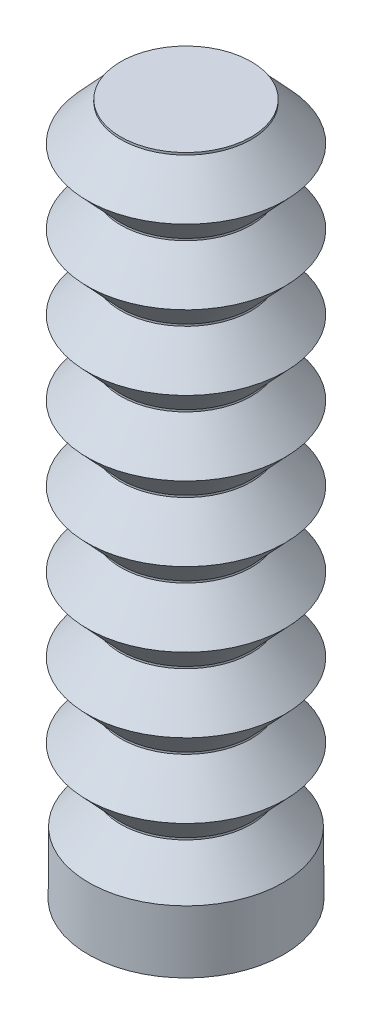
ISO-10303-21;
HEADER;
FILE_DESCRIPTION(('STEP AP214'),'2;1');
FILE_NAME('part.step','',(''),(''),'','','');
FILE_SCHEMA(('AUTOMOTIVE_DESIGN { 1 0 10303 214 1 1 1 1 }'));
ENDSEC;
DATA;
#1=APPLICATION_CONTEXT('core data for automotive mechanical design processes');
#2=APPLICATION_PROTOCOL_DEFINITION('international standard','automotive_design',2000,#1);
#3=PRODUCT_CONTEXT('',#1,'mechanical');
#4=PRODUCT('Part','Part','',(#3));
#5=PRODUCT_RELATED_PRODUCT_CATEGORY('part','',(#4));
#6=PRODUCT_DEFINITION_FORMATION('','',#4);
#7=PRODUCT_DEFINITION_CONTEXT('part definition',#1,'design');
#8=PRODUCT_DEFINITION('design','',#6,#7);
#9=PRODUCT_DEFINITION_SHAPE('','',#8);
#10=(LENGTH_UNIT() NAMED_UNIT(*) SI_UNIT(.MILLI.,.METRE.));
#11=(NAMED_UNIT(*) PLANE_ANGLE_UNIT() SI_UNIT($,.RADIAN.));
#12=(NAMED_UNIT(*) SI_UNIT($,.STERADIAN.) SOLID_ANGLE_UNIT());
#13=UNCERTAINTY_MEASURE_WITH_UNIT(LENGTH_MEASURE(1.E-05),#10,'distance_accuracy_value','');
#14=(GEOMETRIC_REPRESENTATION_CONTEXT(3) GLOBAL_UNCERTAINTY_ASSIGNED_CONTEXT((#13)) GLOBAL_UNIT_ASSIGNED_CONTEXT((#10,
#11,#12)) REPRESENTATION_CONTEXT('',''));
#15=CARTESIAN_POINT('',(0.,0.,0.));
#16=DIRECTION('',(0.,0.,1.));
#17=DIRECTION('',(1.,0.,0.));
#18=AXIS2_PLACEMENT_3D('',#15,#16,#17);
#19=CARTESIAN_POINT('',(-5.43163068128709,-0.900000000000158,0.));
#20=DIRECTION('',(0.,1.,0.));
#21=DIRECTION('',(-1.,0.,0.));
#22=AXIS2_PLACEMENT_3D('',#19,#20,#21);
#23=CONICAL_SURFACE('',#22,4.9365081526756,1.56509007290564);
#24=CARTESIAN_POINT('',(-5.43163068128709,-0.904564978337837,0.));
#25=DIRECTION('',(0.,-1.,0.));
#26=DIRECTION('',(1.,0.,0.));
#27=AXIS2_PLACEMENT_3D('',#24,#25,#26);
#28=CIRCLE('',#27,4.13652117717364);
#29=CARTESIAN_POINT('',(-1.29510950411345,-0.904564978337837,0.));
#30=VERTEX_POINT('',#29);
#31=EDGE_CURVE('E57',#30,#30,#28,.T.);
#32=ORIENTED_EDGE('',*,*,#31,.F.);
#33=EDGE_LOOP('',(#32));
#34=FACE_BOUND('',#33,.T.);
#35=CARTESIAN_POINT('',(-5.43163068128709,-0.900000000000158,0.));
#36=DIRECTION('',(0.,-1.,0.));
#37=DIRECTION('',(1.,0.,0.));
#38=AXIS2_PLACEMENT_3D('',#35,#36,#37);
#39=CIRCLE('',#38,4.9365081526756);
#40=CARTESIAN_POINT('',(-0.495122528611489,-0.900000000000157,0.));
#41=VERTEX_POINT('',#40);
#42=EDGE_CURVE('E59',#41,#41,#39,.T.);
#43=ORIENTED_EDGE('',*,*,#42,.T.);
#44=EDGE_LOOP('',(#43));
#45=FACE_BOUND('',#44,.T.);
#46=ADVANCED_FACE('F37',(#34,#45),#23,.T.);
#47=CARTESIAN_POINT('',(-2.13163068128709,33.3029540037317,0.));
#48=DIRECTION('',(0.,-1.,0.));
#49=DIRECTION('',(1.,0.,0.));
#50=AXIS2_PLACEMENT_3D('',#47,#48,#49);
#51=PLANE('',#50);
#52=CARTESIAN_POINT('',(-5.43163068128709,33.3029540037317,0.));
#53=DIRECTION('',(0.,-1.,0.));
#54=DIRECTION('',(1.,0.,0.));
#55=AXIS2_PLACEMENT_3D('',#52,#53,#54);
#56=CIRCLE('',#55,2.84519448310834);
#57=CARTESIAN_POINT('',(-2.58643619817875,33.3029540037317,0.));
#58=VERTEX_POINT('',#57);
#59=EDGE_CURVE('E10',#58,#58,#56,.T.);
#60=ORIENTED_EDGE('',*,*,#59,.T.);
#61=EDGE_LOOP('',(#60));
#62=FACE_BOUND('',#61,.T.);
#63=ADVANCED_FACE('F287',(#62),#51,.T.);
#64=CARTESIAN_POINT('',(-5.43163068128709,33.4431266067998,0.));
#65=DIRECTION('',(0.,-1.,0.));
#66=DIRECTION('',(1.,0.,0.));
#67=AXIS2_PLACEMENT_3D('',#64,#65,#66);
#68=CONICAL_SURFACE('',#67,2.71462274326405,0.749952023138734);
#69=CARTESIAN_POINT('',(-5.43163068128709,32.1634095308826,0.));
#70=DIRECTION('',(0.,-1.,0.));
#71=DIRECTION('',(1.,0.,0.));
#72=AXIS2_PLACEMENT_3D('',#69,#70,#71);
#73=CIRCLE('',#72,3.90668796466637);
#74=CARTESIAN_POINT('',(-1.52494271662073,32.1634095308826,0.));
#75=VERTEX_POINT('',#74);
#76=EDGE_CURVE('E45',#75,#75,#73,.T.);
#77=ORIENTED_EDGE('',*,*,#76,.T.);
#78=EDGE_LOOP('',(#77));
#79=FACE_BOUND('',#78,.T.);
#80=ORIENTED_EDGE('',*,*,#59,.F.);
#81=EDGE_LOOP('',(#80));
#82=FACE_BOUND('',#81,.T.);
#83=ADVANCED_FACE('F284',(#79,#82),#68,.F.);
#84=CARTESIAN_POINT('',(-5.43163068128709,32.7086924549654,0.));
#85=DIRECTION('',(0.,1.,0.));
#86=DIRECTION('',(-1.,0.,0.));
#87=AXIS2_PLACEMENT_3D('',#84,#85,#86);
#88=CONICAL_SURFACE('',#87,4.41462274326405,0.749952023138734);
#89=CARTESIAN_POINT('',(-5.43163068128709,30.6532886276378,0.));
#90=DIRECTION('',(0.,1.,0.));
#91=DIRECTION('',(-1.,0.,0.));
#92=AXIS2_PLACEMENT_3D('',#89,#90,#91);
#93=CIRCLE('',#92,2.5);
#94=CARTESIAN_POINT('',(-7.93163068128709,30.6532886276378,0.));
#95=VERTEX_POINT('',#94);
#96=EDGE_CURVE('E53',#95,#95,#93,.F.);
#97=ORIENTED_EDGE('',*,*,#96,.T.);
#98=EDGE_LOOP('',(#97));
#99=FACE_BOUND('',#98,.T.);
#100=ORIENTED_EDGE('',*,*,#76,.F.);
#101=EDGE_LOOP('',(#100));
#102=FACE_BOUND('',#101,.T.);
#103=ADVANCED_FACE('F269',(#99,#102),#88,.F.);
#104=CARTESIAN_POINT('',(-5.43163068128709,34.1029540037317,0.));
#105=DIRECTION('',(0.,-1.,0.));
#106=DIRECTION('',(1.,0.,0.));
#107=AXIS2_PLACEMENT_3D('',#104,#105,#106);
#108=CYLINDRICAL_SURFACE('',#107,2.5);
#109=CARTESIAN_POINT('',(-5.43163068128709,29.9235304341274,0.));
#110=DIRECTION('',(0.,-1.,0.));
#111=DIRECTION('',(1.,0.,0.));
#112=AXIS2_PLACEMENT_3D('',#109,#110,#111);
#113=CIRCLE('',#112,2.5);
#114=CARTESIAN_POINT('',(-2.93163068128709,29.9235304341274,0.));
#115=VERTEX_POINT('',#114);
#116=EDGE_CURVE('E261',#115,#115,#113,.T.);
#117=ORIENTED_EDGE('',*,*,#116,.T.);
#118=EDGE_LOOP('',(#117));
#119=FACE_BOUND('',#118,.T.);
#120=ORIENTED_EDGE('',*,*,#96,.F.);
#121=EDGE_LOOP('',(#120));
#122=FACE_BOUND('',#121,.T.);
#123=ADVANCED_FACE('F272',(#119,#122),#108,.F.);
#124=CARTESIAN_POINT('',(-5.43163068128709,29.6931266067998,0.));
#125=DIRECTION('',(0.,-1.,0.));
#126=DIRECTION('',(1.,0.,0.));
#127=AXIS2_PLACEMENT_3D('',#124,#125,#126);
#128=CONICAL_SURFACE('',#127,2.71462274326405,0.749952023138734);
#129=CARTESIAN_POINT('',(-5.43163068128709,28.4134095308826,0.));
#130=DIRECTION('',(0.,-1.,0.));
#131=DIRECTION('',(1.,0.,0.));
#132=AXIS2_PLACEMENT_3D('',#129,#130,#131);
#133=CIRCLE('',#132,3.90668796466641);
#134=CARTESIAN_POINT('',(-1.52494271662068,28.4134095308826,0.));
#135=VERTEX_POINT('',#134);
#136=EDGE_CURVE('E257',#135,#135,#133,.T.);
#137=ORIENTED_EDGE('',*,*,#136,.T.);
#138=EDGE_LOOP('',(#137));
#139=FACE_BOUND('',#138,.T.);
#140=ORIENTED_EDGE('',*,*,#116,.F.);
#141=EDGE_LOOP('',(#140));
#142=FACE_BOUND('',#141,.T.);
#143=ADVANCED_FACE('F274',(#139,#142),#128,.F.);
#144=CARTESIAN_POINT('',(-5.43163068128709,28.9586924549654,0.));
#145=DIRECTION('',(0.,1.,0.));
#146=DIRECTION('',(-1.,0.,0.));
#147=AXIS2_PLACEMENT_3D('',#144,#145,#146);
#148=CONICAL_SURFACE('',#147,4.41462274326409,0.749952023138734);
#149=CARTESIAN_POINT('',(-5.43163068128709,26.9032886276378,0.));
#150=DIRECTION('',(0.,1.,0.));
#151=DIRECTION('',(-1.,0.,0.));
#152=AXIS2_PLACEMENT_3D('',#149,#150,#151);
#153=CIRCLE('',#152,2.50000000000006);
#154=CARTESIAN_POINT('',(-7.93163068128715,26.9032886276378,0.));
#155=VERTEX_POINT('',#154);
#156=EDGE_CURVE('E253',#155,#155,#153,.F.);
#157=ORIENTED_EDGE('',*,*,#156,.T.);
#158=EDGE_LOOP('',(#157));
#159=FACE_BOUND('',#158,.T.);
#160=ORIENTED_EDGE('',*,*,#136,.F.);
#161=EDGE_LOOP('',(#160));
#162=FACE_BOUND('',#161,.T.);
#163=ADVANCED_FACE('F281',(#159,#162),#148,.F.);
#164=CARTESIAN_POINT('',(-5.43163068128709,34.1029540037317,0.));
#165=DIRECTION('',(0.,-1.,0.));
#166=DIRECTION('',(1.,0.,0.));
#167=AXIS2_PLACEMENT_3D('',#164,#165,#166);
#168=CYLINDRICAL_SURFACE('',#167,2.50000000000006);
#169=CARTESIAN_POINT('',(-5.43163068128709,26.1735304341273,0.));
#170=DIRECTION('',(0.,-1.,0.));
#171=DIRECTION('',(1.,0.,0.));
#172=AXIS2_PLACEMENT_3D('',#169,#170,#171);
#173=CIRCLE('',#172,2.50000000000006);
#174=CARTESIAN_POINT('',(-2.93163068128704,26.1735304341273,0.));
#175=VERTEX_POINT('',#174);
#176=EDGE_CURVE('E250',#175,#175,#173,.T.);
#177=ORIENTED_EDGE('',*,*,#176,.T.);
#178=EDGE_LOOP('',(#177));
#179=FACE_BOUND('',#178,.T.);
#180=ORIENTED_EDGE('',*,*,#156,.F.);
#181=EDGE_LOOP('',(#180));
#182=FACE_BOUND('',#181,.T.);
#183=ADVANCED_FACE('F543',(#179,#182),#168,.F.);
#184=CARTESIAN_POINT('',(-5.43163068128709,25.9431266067997,0.));
#185=DIRECTION('',(0.,-1.,0.));
#186=DIRECTION('',(1.,0.,0.));
#187=AXIS2_PLACEMENT_3D('',#184,#185,#186);
#188=CONICAL_SURFACE('',#187,2.71462274326413,0.749952023138734);
#189=CARTESIAN_POINT('',(-5.43163068128709,24.6634095308825,0.));
#190=DIRECTION('',(0.,-1.,0.));
#191=DIRECTION('',(1.,0.,0.));
#192=AXIS2_PLACEMENT_3D('',#189,#190,#191);
#193=CIRCLE('',#192,3.90668796466645);
#194=CARTESIAN_POINT('',(-1.52494271662064,24.6634095308825,0.));
#195=VERTEX_POINT('',#194);
#196=EDGE_CURVE('E246',#195,#195,#193,.T.);
#197=ORIENTED_EDGE('',*,*,#196,.T.);
#198=EDGE_LOOP('',(#197));
#199=FACE_BOUND('',#198,.T.);
#200=ORIENTED_EDGE('',*,*,#176,.F.);
#201=EDGE_LOOP('',(#200));
#202=FACE_BOUND('',#201,.T.);
#203=ADVANCED_FACE('F539',(#199,#202),#188,.F.);
#204=CARTESIAN_POINT('',(-5.43163068128709,25.2086924549653,0.));
#205=DIRECTION('',(0.,1.,0.));
#206=DIRECTION('',(-1.,0.,0.));
#207=AXIS2_PLACEMENT_3D('',#204,#205,#206);
#208=CONICAL_SURFACE('',#207,4.41462274326413,0.749952023138734);
#209=CARTESIAN_POINT('',(-5.43163068128709,23.1532886276378,0.));
#210=DIRECTION('',(0.,1.,0.));
#211=DIRECTION('',(-1.,0.,0.));
#212=AXIS2_PLACEMENT_3D('',#209,#210,#211);
#213=CIRCLE('',#212,2.5000000000001);
#214=CARTESIAN_POINT('',(-7.93163068128719,23.1532886276378,0.));
#215=VERTEX_POINT('',#214);
#216=EDGE_CURVE('E242',#215,#215,#213,.F.);
#217=ORIENTED_EDGE('',*,*,#216,.T.);
#218=EDGE_LOOP('',(#217));
#219=FACE_BOUND('',#218,.T.);
#220=ORIENTED_EDGE('',*,*,#196,.F.);
#221=EDGE_LOOP('',(#220));
#222=FACE_BOUND('',#221,.T.);
#223=ADVANCED_FACE('F535',(#219,#222),#208,.F.);
#224=CARTESIAN_POINT('',(-5.43163068128709,34.1029540037317,0.));
#225=DIRECTION('',(0.,-1.,0.));
#226=DIRECTION('',(1.,0.,0.));
#227=AXIS2_PLACEMENT_3D('',#224,#225,#226);
#228=CYLINDRICAL_SURFACE('',#227,2.5000000000001);
#229=CARTESIAN_POINT('',(-5.43163068128709,22.4235304341273,0.));
#230=DIRECTION('',(0.,-1.,0.));
#231=DIRECTION('',(1.,0.,0.));
#232=AXIS2_PLACEMENT_3D('',#229,#230,#231);
#233=CIRCLE('',#232,2.5000000000001);
#234=CARTESIAN_POINT('',(-2.931630681287,22.4235304341273,0.));
#235=VERTEX_POINT('',#234);
#236=EDGE_CURVE('E238',#235,#235,#233,.T.);
#237=ORIENTED_EDGE('',*,*,#236,.T.);
#238=EDGE_LOOP('',(#237));
#239=FACE_BOUND('',#238,.T.);
#240=ORIENTED_EDGE('',*,*,#216,.F.);
#241=EDGE_LOOP('',(#240));
#242=FACE_BOUND('',#241,.T.);
#243=ADVANCED_FACE('F531',(#239,#242),#228,.F.);
#244=CARTESIAN_POINT('',(-5.43163068128709,22.1931266067997,0.));
#245=DIRECTION('',(0.,-1.,0.));
#246=DIRECTION('',(1.,0.,0.));
#247=AXIS2_PLACEMENT_3D('',#244,#245,#246);
#248=CONICAL_SURFACE('',#247,2.71462274326417,0.749952023138733);
#249=CARTESIAN_POINT('',(-5.43163068128709,20.9134095308825,0.));
#250=DIRECTION('',(0.,-1.,0.));
#251=DIRECTION('',(1.,0.,0.));
#252=AXIS2_PLACEMENT_3D('',#249,#250,#251);
#253=CIRCLE('',#252,3.90668796466648);
#254=CARTESIAN_POINT('',(-1.52494271662061,20.9134095308825,0.));
#255=VERTEX_POINT('',#254);
#256=EDGE_CURVE('E234',#255,#255,#253,.T.);
#257=ORIENTED_EDGE('',*,*,#256,.T.);
#258=EDGE_LOOP('',(#257));
#259=FACE_BOUND('',#258,.T.);
#260=ORIENTED_EDGE('',*,*,#236,.F.);
#261=EDGE_LOOP('',(#260));
#262=FACE_BOUND('',#261,.T.);
#263=ADVANCED_FACE('F527',(#259,#262),#248,.F.);
#264=CARTESIAN_POINT('',(-5.43163068128709,21.4586924549653,0.));
#265=DIRECTION('',(0.,1.,0.));
#266=DIRECTION('',(-1.,0.,0.));
#267=AXIS2_PLACEMENT_3D('',#264,#265,#266);
#268=CONICAL_SURFACE('',#267,4.41462274326417,0.749952023138733);
#269=CARTESIAN_POINT('',(-5.43163068128709,19.4032886276377,0.));
#270=DIRECTION('',(0.,1.,0.));
#271=DIRECTION('',(-1.,0.,0.));
#272=AXIS2_PLACEMENT_3D('',#269,#270,#271);
#273=CIRCLE('',#272,2.50000000000014);
#274=CARTESIAN_POINT('',(-7.93163068128723,19.4032886276377,0.));
#275=VERTEX_POINT('',#274);
#276=EDGE_CURVE('E230',#275,#275,#273,.F.);
#277=ORIENTED_EDGE('',*,*,#276,.T.);
#278=EDGE_LOOP('',(#277));
#279=FACE_BOUND('',#278,.T.);
#280=ORIENTED_EDGE('',*,*,#256,.F.);
#281=EDGE_LOOP('',(#280));
#282=FACE_BOUND('',#281,.T.);
#283=ADVANCED_FACE('F523',(#279,#282),#268,.F.);
#284=CARTESIAN_POINT('',(-5.43163068128709,34.1029540037317,0.));
#285=DIRECTION('',(0.,-1.,0.));
#286=DIRECTION('',(1.,0.,0.));
#287=AXIS2_PLACEMENT_3D('',#284,#285,#286);
#288=CYLINDRICAL_SURFACE('',#287,2.50000000000014);
#289=CARTESIAN_POINT('',(-5.43163068128709,18.6735304341273,0.));
#290=DIRECTION('',(0.,-1.,0.));
#291=DIRECTION('',(1.,0.,0.));
#292=AXIS2_PLACEMENT_3D('',#289,#290,#291);
#293=CIRCLE('',#292,2.50000000000014);
#294=CARTESIAN_POINT('',(-2.93163068128696,18.6735304341273,0.));
#295=VERTEX_POINT('',#294);
#296=EDGE_CURVE('E226',#295,#295,#293,.T.);
#297=ORIENTED_EDGE('',*,*,#296,.T.);
#298=EDGE_LOOP('',(#297));
#299=FACE_BOUND('',#298,.T.);
#300=ORIENTED_EDGE('',*,*,#276,.F.);
#301=EDGE_LOOP('',(#300));
#302=FACE_BOUND('',#301,.T.);
#303=ADVANCED_FACE('F519',(#299,#302),#288,.F.);
#304=CARTESIAN_POINT('',(-5.43163068128709,18.4431266067997,0.));
#305=DIRECTION('',(0.,-1.,0.));
#306=DIRECTION('',(1.,0.,0.));
#307=AXIS2_PLACEMENT_3D('',#304,#305,#306);
#308=CONICAL_SURFACE('',#307,2.7146227432642,0.749952023138734);
#309=CARTESIAN_POINT('',(-5.43163068128709,17.1634095308825,0.));
#310=DIRECTION('',(0.,-1.,0.));
#311=DIRECTION('',(1.,0.,0.));
#312=AXIS2_PLACEMENT_3D('',#309,#310,#311);
#313=CIRCLE('',#312,3.90668796466652);
#314=CARTESIAN_POINT('',(-1.52494271662057,17.1634095308825,0.));
#315=VERTEX_POINT('',#314);
#316=EDGE_CURVE('E222',#315,#315,#313,.T.);
#317=ORIENTED_EDGE('',*,*,#316,.T.);
#318=EDGE_LOOP('',(#317));
#319=FACE_BOUND('',#318,.T.);
#320=ORIENTED_EDGE('',*,*,#296,.F.);
#321=EDGE_LOOP('',(#320));
#322=FACE_BOUND('',#321,.T.);
#323=ADVANCED_FACE('F515',(#319,#322),#308,.F.);
#324=CARTESIAN_POINT('',(-5.43163068128709,17.7086924549653,0.));
#325=DIRECTION('',(0.,1.,0.));
#326=DIRECTION('',(-1.,0.,0.));
#327=AXIS2_PLACEMENT_3D('',#324,#325,#326);
#328=CONICAL_SURFACE('',#327,4.4146227432642,0.749952023138733);
#329=CARTESIAN_POINT('',(-5.43163068128709,15.6532886276377,0.));
#330=DIRECTION('',(0.,1.,0.));
#331=DIRECTION('',(-1.,0.,0.));
#332=AXIS2_PLACEMENT_3D('',#329,#330,#331);
#333=CIRCLE('',#332,2.50000000000018);
#334=CARTESIAN_POINT('',(-7.93163068128727,15.6532886276377,0.));
#335=VERTEX_POINT('',#334);
#336=EDGE_CURVE('E218',#335,#335,#333,.F.);
#337=ORIENTED_EDGE('',*,*,#336,.T.);
#338=EDGE_LOOP('',(#337));
#339=FACE_BOUND('',#338,.T.);
#340=ORIENTED_EDGE('',*,*,#316,.F.);
#341=EDGE_LOOP('',(#340));
#342=FACE_BOUND('',#341,.T.);
#343=ADVANCED_FACE('F511',(#339,#342),#328,.F.);
#344=CARTESIAN_POINT('',(-5.43163068128709,34.1029540037317,0.));
#345=DIRECTION('',(0.,-1.,0.));
#346=DIRECTION('',(1.,0.,0.));
#347=AXIS2_PLACEMENT_3D('',#344,#345,#346);
#348=CYLINDRICAL_SURFACE('',#347,2.50000000000018);
#349=CARTESIAN_POINT('',(-5.43163068128709,14.9235304341272,0.));
#350=DIRECTION('',(0.,-1.,0.));
#351=DIRECTION('',(1.,0.,0.));
#352=AXIS2_PLACEMENT_3D('',#349,#350,#351);
#353=CIRCLE('',#352,2.50000000000018);
#354=CARTESIAN_POINT('',(-2.93163068128692,14.9235304341272,0.));
#355=VERTEX_POINT('',#354);
#356=EDGE_CURVE('E215',#355,#355,#353,.T.);
#357=ORIENTED_EDGE('',*,*,#356,.T.);
#358=EDGE_LOOP('',(#357));
#359=FACE_BOUND('',#358,.T.);
#360=ORIENTED_EDGE('',*,*,#336,.F.);
#361=EDGE_LOOP('',(#360));
#362=FACE_BOUND('',#361,.T.);
#363=ADVANCED_FACE('F507',(#359,#362),#348,.F.);
#364=CARTESIAN_POINT('',(-5.43163068128709,14.6931266067996,0.));
#365=DIRECTION('',(0.,-1.,0.));
#366=DIRECTION('',(1.,0.,0.));
#367=AXIS2_PLACEMENT_3D('',#364,#365,#366);
#368=CONICAL_SURFACE('',#367,2.71462274326424,0.749952023138734);
#369=CARTESIAN_POINT('',(-5.43163068128709,13.4134095308824,0.));
#370=DIRECTION('',(0.,-1.,0.));
#371=DIRECTION('',(1.,0.,0.));
#372=AXIS2_PLACEMENT_3D('',#369,#370,#371);
#373=CIRCLE('',#372,3.90668796466656);
#374=CARTESIAN_POINT('',(-1.52494271662053,13.4134095308824,0.));
#375=VERTEX_POINT('',#374);
#376=EDGE_CURVE('E211',#375,#375,#373,.T.);
#377=ORIENTED_EDGE('',*,*,#376,.T.);
#378=EDGE_LOOP('',(#377));
#379=FACE_BOUND('',#378,.T.);
#380=ORIENTED_EDGE('',*,*,#356,.F.);
#381=EDGE_LOOP('',(#380));
#382=FACE_BOUND('',#381,.T.);
#383=ADVANCED_FACE('F503',(#379,#382),#368,.F.);
#384=CARTESIAN_POINT('',(-5.43163068128709,13.9586924549652,0.));
#385=DIRECTION('',(0.,1.,0.));
#386=DIRECTION('',(-1.,0.,0.));
#387=AXIS2_PLACEMENT_3D('',#384,#385,#386);
#388=CONICAL_SURFACE('',#387,4.41462274326424,0.749952023138734);
#389=CARTESIAN_POINT('',(-5.43163068128709,11.9032886276377,0.));
#390=DIRECTION('',(0.,1.,0.));
#391=DIRECTION('',(-1.,0.,0.));
#392=AXIS2_PLACEMENT_3D('',#389,#390,#391);
#393=CIRCLE('',#392,2.50000000000021);
#394=CARTESIAN_POINT('',(-7.93163068128731,11.9032886276377,0.));
#395=VERTEX_POINT('',#394);
#396=EDGE_CURVE('E207',#395,#395,#393,.F.);
#397=ORIENTED_EDGE('',*,*,#396,.T.);
#398=EDGE_LOOP('',(#397));
#399=FACE_BOUND('',#398,.T.);
#400=ORIENTED_EDGE('',*,*,#376,.F.);
#401=EDGE_LOOP('',(#400));
#402=FACE_BOUND('',#401,.T.);
#403=ADVANCED_FACE('F499',(#399,#402),#388,.F.);
#404=CARTESIAN_POINT('',(-5.43163068128709,34.1029540037317,0.));
#405=DIRECTION('',(0.,-1.,0.));
#406=DIRECTION('',(1.,0.,0.));
#407=AXIS2_PLACEMENT_3D('',#404,#405,#406);
#408=CYLINDRICAL_SURFACE('',#407,2.50000000000021);
#409=CARTESIAN_POINT('',(-5.43163068128709,11.1735304341272,0.));
#410=DIRECTION('',(0.,-1.,0.));
#411=DIRECTION('',(1.,0.,0.));
#412=AXIS2_PLACEMENT_3D('',#409,#410,#411);
#413=CIRCLE('',#412,2.50000000000021);
#414=CARTESIAN_POINT('',(-2.93163068128688,11.1735304341272,0.));
#415=VERTEX_POINT('',#414);
#416=EDGE_CURVE('E203',#415,#415,#413,.T.);
#417=ORIENTED_EDGE('',*,*,#416,.T.);
#418=EDGE_LOOP('',(#417));
#419=FACE_BOUND('',#418,.T.);
#420=ORIENTED_EDGE('',*,*,#396,.F.);
#421=EDGE_LOOP('',(#420));
#422=FACE_BOUND('',#421,.T.);
#423=ADVANCED_FACE('F495',(#419,#422),#408,.F.);
#424=CARTESIAN_POINT('',(-5.43163068128709,10.9431266067996,0.));
#425=DIRECTION('',(0.,-1.,0.));
#426=DIRECTION('',(1.,0.,0.));
#427=AXIS2_PLACEMENT_3D('',#424,#425,#426);
#428=CONICAL_SURFACE('',#427,2.71462274326428,0.749952023138734);
#429=CARTESIAN_POINT('',(-5.43163068128709,9.66340953088238,0.));
#430=DIRECTION('',(0.,-1.,0.));
#431=DIRECTION('',(1.,0.,0.));
#432=AXIS2_PLACEMENT_3D('',#429,#430,#431);
#433=CIRCLE('',#432,3.9066879646666);
#434=CARTESIAN_POINT('',(-1.52494271662049,9.66340953088238,0.));
#435=VERTEX_POINT('',#434);
#436=EDGE_CURVE('E199',#435,#435,#433,.T.);
#437=ORIENTED_EDGE('',*,*,#436,.T.);
#438=EDGE_LOOP('',(#437));
#439=FACE_BOUND('',#438,.T.);
#440=ORIENTED_EDGE('',*,*,#416,.F.);
#441=EDGE_LOOP('',(#440));
#442=FACE_BOUND('',#441,.T.);
#443=ADVANCED_FACE('F491',(#439,#442),#428,.F.);
#444=CARTESIAN_POINT('',(-5.43163068128709,10.2086924549652,0.));
#445=DIRECTION('',(0.,1.,0.));
#446=DIRECTION('',(-1.,0.,0.));
#447=AXIS2_PLACEMENT_3D('',#444,#445,#446);
#448=CONICAL_SURFACE('',#447,4.41462274326428,0.749952023138734);
#449=CARTESIAN_POINT('',(-5.43163068128709,8.15328862763762,0.));
#450=DIRECTION('',(0.,1.,0.));
#451=DIRECTION('',(-1.,0.,0.));
#452=AXIS2_PLACEMENT_3D('',#449,#450,#451);
#453=CIRCLE('',#452,2.50000000000025);
#454=CARTESIAN_POINT('',(-7.93163068128734,8.15328862763762,0.));
#455=VERTEX_POINT('',#454);
#456=EDGE_CURVE('E195',#455,#455,#453,.F.);
#457=ORIENTED_EDGE('',*,*,#456,.T.);
#458=EDGE_LOOP('',(#457));
#459=FACE_BOUND('',#458,.T.);
#460=ORIENTED_EDGE('',*,*,#436,.F.);
#461=EDGE_LOOP('',(#460));
#462=FACE_BOUND('',#461,.T.);
#463=ADVANCED_FACE('F487',(#459,#462),#448,.F.);
#464=CARTESIAN_POINT('',(-5.43163068128709,34.1029540037317,0.));
#465=DIRECTION('',(0.,-1.,0.));
#466=DIRECTION('',(1.,0.,0.));
#467=AXIS2_PLACEMENT_3D('',#464,#465,#466);
#468=CYLINDRICAL_SURFACE('',#467,2.50000000000025);
#469=CARTESIAN_POINT('',(-5.43163068128709,7.42353043412714,0.));
#470=DIRECTION('',(0.,-1.,0.));
#471=DIRECTION('',(1.,0.,0.));
#472=AXIS2_PLACEMENT_3D('',#469,#470,#471);
#473=CIRCLE('',#472,2.50000000000025);
#474=CARTESIAN_POINT('',(-2.93163068128684,7.42353043412714,0.));
#475=VERTEX_POINT('',#474);
#476=EDGE_CURVE('E192',#475,#475,#473,.T.);
#477=ORIENTED_EDGE('',*,*,#476,.T.);
#478=EDGE_LOOP('',(#477));
#479=FACE_BOUND('',#478,.T.);
#480=ORIENTED_EDGE('',*,*,#456,.F.);
#481=EDGE_LOOP('',(#480));
#482=FACE_BOUND('',#481,.T.);
#483=ADVANCED_FACE('F483',(#479,#482),#468,.F.);
#484=CARTESIAN_POINT('',(-5.43163068128709,7.19312660679953,0.));
#485=DIRECTION('',(0.,-1.,0.));
#486=DIRECTION('',(1.,0.,0.));
#487=AXIS2_PLACEMENT_3D('',#484,#485,#486);
#488=CONICAL_SURFACE('',#487,2.71462274326432,0.749952023138734);
#489=CARTESIAN_POINT('',(-5.43163068128709,5.91340953088234,0.));
#490=DIRECTION('',(0.,-1.,0.));
#491=DIRECTION('',(1.,0.,0.));
#492=AXIS2_PLACEMENT_3D('',#489,#490,#491);
#493=CIRCLE('',#492,3.90668796466664);
#494=CARTESIAN_POINT('',(-1.52494271662045,5.91340953088234,0.));
#495=VERTEX_POINT('',#494);
#496=EDGE_CURVE('E188',#495,#495,#493,.T.);
#497=ORIENTED_EDGE('',*,*,#496,.T.);
#498=EDGE_LOOP('',(#497));
#499=FACE_BOUND('',#498,.T.);
#500=ORIENTED_EDGE('',*,*,#476,.F.);
#501=EDGE_LOOP('',(#500));
#502=FACE_BOUND('',#501,.T.);
#503=ADVANCED_FACE('F479',(#499,#502),#488,.F.);
#504=CARTESIAN_POINT('',(-5.43163068128709,6.45869245496514,0.));
#505=DIRECTION('',(0.,1.,0.));
#506=DIRECTION('',(-1.,0.,0.));
#507=AXIS2_PLACEMENT_3D('',#504,#505,#506);
#508=CONICAL_SURFACE('',#507,4.41462274326432,0.749952023138733);
#509=CARTESIAN_POINT('',(-5.43163068128709,4.40328862763758,0.));
#510=DIRECTION('',(0.,1.,0.));
#511=DIRECTION('',(-1.,0.,0.));
#512=AXIS2_PLACEMENT_3D('',#509,#510,#511);
#513=CIRCLE('',#512,2.50000000000029);
#514=CARTESIAN_POINT('',(-7.93163068128738,4.40328862763758,0.));
#515=VERTEX_POINT('',#514);
#516=EDGE_CURVE('E184',#515,#515,#513,.F.);
#517=ORIENTED_EDGE('',*,*,#516,.T.);
#518=EDGE_LOOP('',(#517));
#519=FACE_BOUND('',#518,.T.);
#520=ORIENTED_EDGE('',*,*,#496,.F.);
#521=EDGE_LOOP('',(#520));
#522=FACE_BOUND('',#521,.T.);
#523=ADVANCED_FACE('F475',(#519,#522),#508,.F.);
#524=CARTESIAN_POINT('',(-5.43163068128709,34.1029540037317,0.));
#525=DIRECTION('',(0.,-1.,0.));
#526=DIRECTION('',(1.,0.,0.));
#527=AXIS2_PLACEMENT_3D('',#524,#525,#526);
#528=CYLINDRICAL_SURFACE('',#527,2.50000000000029);
#529=CARTESIAN_POINT('',(-5.43163068128709,3.6742367822535,0.));
#530=DIRECTION('',(0.,-1.,0.));
#531=DIRECTION('',(1.,0.,0.));
#532=AXIS2_PLACEMENT_3D('',#529,#530,#531);
#533=CIRCLE('',#532,2.50000000000029);
#534=CARTESIAN_POINT('',(-2.9316306812868,3.6742367822535,0.));
#535=VERTEX_POINT('',#534);
#536=EDGE_CURVE('E179',#535,#535,#533,.T.);
#537=ORIENTED_EDGE('',*,*,#536,.T.);
#538=EDGE_LOOP('',(#537));
#539=FACE_BOUND('',#538,.T.);
#540=ORIENTED_EDGE('',*,*,#516,.F.);
#541=EDGE_LOOP('',(#540));
#542=FACE_BOUND('',#541,.T.);
#543=ADVANCED_FACE('F469',(#539,#542),#528,.F.);
#544=CARTESIAN_POINT('',(-5.43163068128709,3.44402255402613,0.));
#545=DIRECTION('',(0.,-1.,0.));
#546=DIRECTION('',(1.,0.,0.));
#547=AXIS2_PLACEMENT_3D('',#544,#545,#546);
#548=CONICAL_SURFACE('',#547,2.7137894410461,0.74842256535505);
#549=CARTESIAN_POINT('',(-5.43163068128709,1.92940061099429,0.));
#550=DIRECTION('',(0.,-1.,0.));
#551=DIRECTION('',(1.,0.,0.));
#552=AXIS2_PLACEMENT_3D('',#549,#550,#551);
#553=CIRCLE('',#552,4.12034967448522);
#554=CARTESIAN_POINT('',(-1.31128100680187,1.92940061099429,0.));
#555=VERTEX_POINT('',#554);
#556=EDGE_CURVE('E168',#555,#555,#553,.T.);
#557=ORIENTED_EDGE('',*,*,#556,.T.);
#558=EDGE_LOOP('',(#557));
#559=FACE_BOUND('',#558,.T.);
#560=ORIENTED_EDGE('',*,*,#536,.F.);
#561=EDGE_LOOP('',(#560));
#562=FACE_BOUND('',#561,.T.);
#563=ADVANCED_FACE('F463',(#559,#562),#548,.F.);
#564=CARTESIAN_POINT('',(-5.43163068128709,2.24093670680307,0.));
#565=DIRECTION('',(0.,-1.,0.));
#566=DIRECTION('',(1.,0.,0.));
#567=AXIS2_PLACEMENT_3D('',#564,#565,#566);
#568=CONICAL_SURFACE('',#567,4.11857195113181,0.00570625388925514);
#569=ORIENTED_EDGE('',*,*,#31,.T.);
#570=EDGE_LOOP('',(#569));
#571=FACE_BOUND('',#570,.T.);
#572=ORIENTED_EDGE('',*,*,#556,.F.);
#573=EDGE_LOOP('',(#572));
#574=FACE_BOUND('',#573,.T.);
#575=ADVANCED_FACE('F458',(#571,#574),#568,.F.);
#576=CARTESIAN_POINT('',(-2.13163068128709,34.1029540037317,0.));
#577=DIRECTION('',(0.,-1.,0.));
#578=DIRECTION('',(1.,0.,0.));
#579=AXIS2_PLACEMENT_3D('',#576,#577,#578);
#580=PLANE('',#579);
#581=CARTESIAN_POINT('',(-5.43163068128709,34.1029540037317,0.));
#582=DIRECTION('',(0.,-1.,0.));
#583=DIRECTION('',(1.,0.,0.));
#584=AXIS2_PLACEMENT_3D('',#581,#582,#583);
#585=CIRCLE('',#584,3.3);
#586=CARTESIAN_POINT('',(-2.13163068128709,34.1029540037317,0.));
#587=VERTEX_POINT('',#586);
#588=EDGE_CURVE('E40',#587,#587,#585,.T.);
#589=ORIENTED_EDGE('',*,*,#588,.F.);
#590=EDGE_LOOP('',(#589));
#591=FACE_BOUND('',#590,.T.);
#592=ADVANCED_FACE('F454',(#591),#580,.F.);
#593=CARTESIAN_POINT('',(-5.43163068128709,34.1029540037317,0.));
#594=DIRECTION('',(0.,-1.,0.));
#595=DIRECTION('',(1.,0.,0.));
#596=AXIS2_PLACEMENT_3D('',#593,#594,#595);
#597=CYLINDRICAL_SURFACE('',#596,3.3);
#598=CARTESIAN_POINT('',(-5.43163068128709,33.9884095308826,0.));
#599=DIRECTION('',(0.,-1.,0.));
#600=DIRECTION('',(1.,0.,0.));
#601=AXIS2_PLACEMENT_3D('',#598,#599,#600);
#602=CIRCLE('',#601,3.3);
#603=CARTESIAN_POINT('',(-2.13163068128709,33.9884095308826,0.));
#604=VERTEX_POINT('',#603);
#605=EDGE_CURVE('E160',#604,#604,#602,.T.);
#606=ORIENTED_EDGE('',*,*,#605,.F.);
#607=EDGE_LOOP('',(#606));
#608=FACE_BOUND('',#607,.T.);
#609=ORIENTED_EDGE('',*,*,#588,.T.);
#610=EDGE_LOOP('',(#609));
#611=FACE_BOUND('',#610,.T.);
#612=ADVANCED_FACE('F449',(#608,#611),#597,.T.);
#613=CARTESIAN_POINT('',(-5.43163068128709,33.9884095308826,0.));
#614=DIRECTION('',(0.,-1.,0.));
#615=DIRECTION('',(1.,0.,0.));
#616=AXIS2_PLACEMENT_3D('',#613,#614,#615);
#617=CONICAL_SURFACE('',#616,3.3,0.749952023138734);
#618=CARTESIAN_POINT('',(-5.43163068128709,32.1634095308826,0.));
#619=DIRECTION('',(0.,-1.,0.));
#620=DIRECTION('',(1.,0.,0.));
#621=AXIS2_PLACEMENT_3D('',#618,#619,#620);
#622=CIRCLE('',#621,5.);
#623=CARTESIAN_POINT('',(-0.431630681287094,32.1634095308826,0.));
#624=VERTEX_POINT('',#623);
#625=EDGE_CURVE('E157',#624,#624,#622,.T.);
#626=ORIENTED_EDGE('',*,*,#625,.F.);
#627=EDGE_LOOP('',(#626));
#628=FACE_BOUND('',#627,.T.);
#629=ORIENTED_EDGE('',*,*,#605,.T.);
#630=EDGE_LOOP('',(#629));
#631=FACE_BOUND('',#630,.T.);
#632=ADVANCED_FACE('F444',(#628,#631),#617,.T.);
#633=CARTESIAN_POINT('',(-5.43163068128709,32.1634095308826,0.));
#634=DIRECTION('',(0.,1.,0.));
#635=DIRECTION('',(-1.,0.,0.));
#636=AXIS2_PLACEMENT_3D('',#633,#634,#635);
#637=CONICAL_SURFACE('',#636,5.,0.749952023138734);
#638=CARTESIAN_POINT('',(-5.43163068128709,30.3384095308826,0.));
#639=DIRECTION('',(0.,-1.,0.));
#640=DIRECTION('',(1.,0.,0.));
#641=AXIS2_PLACEMENT_3D('',#638,#639,#640);
#642=CIRCLE('',#641,3.3);
#643=CARTESIAN_POINT('',(-2.13163068128709,30.3384095308826,0.));
#644=VERTEX_POINT('',#643);
#645=EDGE_CURVE('E153',#644,#644,#642,.T.);
#646=ORIENTED_EDGE('',*,*,#645,.F.);
#647=EDGE_LOOP('',(#646));
#648=FACE_BOUND('',#647,.T.);
#649=ORIENTED_EDGE('',*,*,#625,.T.);
#650=EDGE_LOOP('',(#649));
#651=FACE_BOUND('',#650,.T.);
#652=ADVANCED_FACE('F438',(#648,#651),#637,.T.);
#653=CARTESIAN_POINT('',(-5.43163068128709,34.1029540037317,0.));
#654=DIRECTION('',(0.,-1.,0.));
#655=DIRECTION('',(1.,0.,0.));
#656=AXIS2_PLACEMENT_3D('',#653,#654,#655);
#657=CYLINDRICAL_SURFACE('',#656,3.3);
#658=CARTESIAN_POINT('',(-5.43163068128709,30.2384095308826,0.));
#659=DIRECTION('',(0.,-1.,0.));
#660=DIRECTION('',(1.,0.,0.));
#661=AXIS2_PLACEMENT_3D('',#658,#659,#660);
#662=CIRCLE('',#661,3.3);
#663=CARTESIAN_POINT('',(-2.13163068128709,30.2384095308826,0.));
#664=VERTEX_POINT('',#663);
#665=EDGE_CURVE('E149',#664,#664,#662,.T.);
#666=ORIENTED_EDGE('',*,*,#665,.F.);
#667=EDGE_LOOP('',(#666));
#668=FACE_BOUND('',#667,.T.);
#669=ORIENTED_EDGE('',*,*,#645,.T.);
#670=EDGE_LOOP('',(#669));
#671=FACE_BOUND('',#670,.T.);
#672=ADVANCED_FACE('F432',(#668,#671),#657,.T.);
#673=CARTESIAN_POINT('',(-5.43163068128709,30.2384095308826,0.));
#674=DIRECTION('',(0.,-1.,0.));
#675=DIRECTION('',(1.,0.,0.));
#676=AXIS2_PLACEMENT_3D('',#673,#674,#675);
#677=CONICAL_SURFACE('',#676,3.3,0.749952023138734);
#678=CARTESIAN_POINT('',(-5.43163068128709,28.4134095308826,0.));
#679=DIRECTION('',(0.,-1.,0.));
#680=DIRECTION('',(1.,0.,0.));
#681=AXIS2_PLACEMENT_3D('',#678,#679,#680);
#682=CIRCLE('',#681,5.00000000000004);
#683=CARTESIAN_POINT('',(-0.431630681287054,28.4134095308826,0.));
#684=VERTEX_POINT('',#683);
#685=EDGE_CURVE('E145',#684,#684,#682,.T.);
#686=ORIENTED_EDGE('',*,*,#685,.F.);
#687=EDGE_LOOP('',(#686));
#688=FACE_BOUND('',#687,.T.);
#689=ORIENTED_EDGE('',*,*,#665,.T.);
#690=EDGE_LOOP('',(#689));
#691=FACE_BOUND('',#690,.T.);
#692=ADVANCED_FACE('F426',(#688,#691),#677,.T.);
#693=CARTESIAN_POINT('',(-5.43163068128709,28.4134095308826,0.));
#694=DIRECTION('',(0.,1.,0.));
#695=DIRECTION('',(-1.,0.,0.));
#696=AXIS2_PLACEMENT_3D('',#693,#694,#695);
#697=CONICAL_SURFACE('',#696,5.00000000000004,0.749952023138734);
#698=CARTESIAN_POINT('',(-5.43163068128709,26.5884095308826,0.));
#699=DIRECTION('',(0.,-1.,0.));
#700=DIRECTION('',(1.,0.,0.));
#701=AXIS2_PLACEMENT_3D('',#698,#699,#700);
#702=CIRCLE('',#701,3.30000000000004);
#703=CARTESIAN_POINT('',(-2.13163068128705,26.5884095308826,0.));
#704=VERTEX_POINT('',#703);
#705=EDGE_CURVE('E141',#704,#704,#702,.T.);
#706=ORIENTED_EDGE('',*,*,#705,.F.);
#707=EDGE_LOOP('',(#706));
#708=FACE_BOUND('',#707,.T.);
#709=ORIENTED_EDGE('',*,*,#685,.T.);
#710=EDGE_LOOP('',(#709));
#711=FACE_BOUND('',#710,.T.);
#712=ADVANCED_FACE('F420',(#708,#711),#697,.T.);
#713=CARTESIAN_POINT('',(-5.43163068128709,34.1029540037317,0.));
#714=DIRECTION('',(0.,-1.,0.));
#715=DIRECTION('',(1.,0.,0.));
#716=AXIS2_PLACEMENT_3D('',#713,#714,#715);
#717=CYLINDRICAL_SURFACE('',#716,3.30000000000006);
#718=CARTESIAN_POINT('',(-5.43163068128709,26.4884095308825,0.));
#719=DIRECTION('',(0.,-1.,0.));
#720=DIRECTION('',(1.,0.,0.));
#721=AXIS2_PLACEMENT_3D('',#718,#719,#720);
#722=CIRCLE('',#721,3.30000000000008);
#723=CARTESIAN_POINT('',(-2.13163068128702,26.4884095308825,0.));
#724=VERTEX_POINT('',#723);
#725=EDGE_CURVE('E137',#724,#724,#722,.T.);
#726=ORIENTED_EDGE('',*,*,#725,.F.);
#727=EDGE_LOOP('',(#726));
#728=FACE_BOUND('',#727,.T.);
#729=ORIENTED_EDGE('',*,*,#705,.T.);
#730=EDGE_LOOP('',(#729));
#731=FACE_BOUND('',#730,.T.);
#732=ADVANCED_FACE('F414',(#728,#731),#717,.T.);
#733=CARTESIAN_POINT('',(-5.43163068128709,26.4884095308825,0.));
#734=DIRECTION('',(0.,-1.,0.));
#735=DIRECTION('',(1.,0.,0.));
#736=AXIS2_PLACEMENT_3D('',#733,#734,#735);
#737=CONICAL_SURFACE('',#736,3.30000000000008,0.749952023138734);
#738=CARTESIAN_POINT('',(-5.43163068128709,24.6634095308825,0.));
#739=DIRECTION('',(0.,-1.,0.));
#740=DIRECTION('',(1.,0.,0.));
#741=AXIS2_PLACEMENT_3D('',#738,#739,#740);
#742=CIRCLE('',#741,5.00000000000008);
#743=CARTESIAN_POINT('',(-0.431630681287015,24.6634095308825,0.));
#744=VERTEX_POINT('',#743);
#745=EDGE_CURVE('E133',#744,#744,#742,.T.);
#746=ORIENTED_EDGE('',*,*,#745,.F.);
#747=EDGE_LOOP('',(#746));
#748=FACE_BOUND('',#747,.T.);
#749=ORIENTED_EDGE('',*,*,#725,.T.);
#750=EDGE_LOOP('',(#749));
#751=FACE_BOUND('',#750,.T.);
#752=ADVANCED_FACE('F408',(#748,#751),#737,.T.);
#753=CARTESIAN_POINT('',(-5.43163068128709,24.6634095308825,0.));
#754=DIRECTION('',(0.,1.,0.));
#755=DIRECTION('',(-1.,0.,0.));
#756=AXIS2_PLACEMENT_3D('',#753,#754,#755);
#757=CONICAL_SURFACE('',#756,5.00000000000008,0.749952023138734);
#758=CARTESIAN_POINT('',(-5.43163068128709,22.8384095308825,0.));
#759=DIRECTION('',(0.,-1.,0.));
#760=DIRECTION('',(1.,0.,0.));
#761=AXIS2_PLACEMENT_3D('',#758,#759,#760);
#762=CIRCLE('',#761,3.30000000000008);
#763=CARTESIAN_POINT('',(-2.13163068128702,22.8384095308825,0.));
#764=VERTEX_POINT('',#763);
#765=EDGE_CURVE('E129',#764,#764,#762,.T.);
#766=ORIENTED_EDGE('',*,*,#765,.F.);
#767=EDGE_LOOP('',(#766));
#768=FACE_BOUND('',#767,.T.);
#769=ORIENTED_EDGE('',*,*,#745,.T.);
#770=EDGE_LOOP('',(#769));
#771=FACE_BOUND('',#770,.T.);
#772=ADVANCED_FACE('F402',(#768,#771),#757,.T.);
#773=CARTESIAN_POINT('',(-5.43163068128709,34.1029540037317,0.));
#774=DIRECTION('',(0.,-1.,0.));
#775=DIRECTION('',(1.,0.,0.));
#776=AXIS2_PLACEMENT_3D('',#773,#774,#775);
#777=CYLINDRICAL_SURFACE('',#776,3.3000000000001);
#778=CARTESIAN_POINT('',(-5.43163068128709,22.7384095308825,0.));
#779=DIRECTION('',(0.,-1.,0.));
#780=DIRECTION('',(1.,0.,0.));
#781=AXIS2_PLACEMENT_3D('',#778,#779,#780);
#782=CIRCLE('',#781,3.30000000000012);
#783=CARTESIAN_POINT('',(-2.13163068128698,22.7384095308825,0.));
#784=VERTEX_POINT('',#783);
#785=EDGE_CURVE('E125',#784,#784,#782,.T.);
#786=ORIENTED_EDGE('',*,*,#785,.F.);
#787=EDGE_LOOP('',(#786));
#788=FACE_BOUND('',#787,.T.);
#789=ORIENTED_EDGE('',*,*,#765,.T.);
#790=EDGE_LOOP('',(#789));
#791=FACE_BOUND('',#790,.T.);
#792=ADVANCED_FACE('F396',(#788,#791),#777,.T.);
#793=CARTESIAN_POINT('',(-5.43163068128709,22.7384095308825,0.));
#794=DIRECTION('',(0.,-1.,0.));
#795=DIRECTION('',(1.,0.,0.));
#796=AXIS2_PLACEMENT_3D('',#793,#794,#795);
#797=CONICAL_SURFACE('',#796,3.30000000000012,0.749952023138733);
#798=CARTESIAN_POINT('',(-5.43163068128709,20.9134095308825,0.));
#799=DIRECTION('',(0.,-1.,0.));
#800=DIRECTION('',(1.,0.,0.));
#801=AXIS2_PLACEMENT_3D('',#798,#799,#800);
#802=CIRCLE('',#801,5.00000000000012);
#803=CARTESIAN_POINT('',(-0.431630681286976,20.9134095308825,0.));
#804=VERTEX_POINT('',#803);
#805=EDGE_CURVE('E122',#804,#804,#802,.T.);
#806=ORIENTED_EDGE('',*,*,#805,.F.);
#807=EDGE_LOOP('',(#806));
#808=FACE_BOUND('',#807,.T.);
#809=ORIENTED_EDGE('',*,*,#785,.T.);
#810=EDGE_LOOP('',(#809));
#811=FACE_BOUND('',#810,.T.);
#812=ADVANCED_FACE('F390',(#808,#811),#797,.T.);
#813=CARTESIAN_POINT('',(-5.43163068128709,20.9134095308825,0.));
#814=DIRECTION('',(0.,1.,0.));
#815=DIRECTION('',(-1.,0.,0.));
#816=AXIS2_PLACEMENT_3D('',#813,#814,#815);
#817=CONICAL_SURFACE('',#816,5.00000000000012,0.749952023138733);
#818=CARTESIAN_POINT('',(-5.43163068128709,19.0884095308825,0.));
#819=DIRECTION('',(0.,-1.,0.));
#820=DIRECTION('',(1.,0.,0.));
#821=AXIS2_PLACEMENT_3D('',#818,#819,#820);
#822=CIRCLE('',#821,3.30000000000012);
#823=CARTESIAN_POINT('',(-2.13163068128698,19.0884095308825,0.));
#824=VERTEX_POINT('',#823);
#825=EDGE_CURVE('E118',#824,#824,#822,.T.);
#826=ORIENTED_EDGE('',*,*,#825,.F.);
#827=EDGE_LOOP('',(#826));
#828=FACE_BOUND('',#827,.T.);
#829=ORIENTED_EDGE('',*,*,#805,.T.);
#830=EDGE_LOOP('',(#829));
#831=FACE_BOUND('',#830,.T.);
#832=ADVANCED_FACE('F384',(#828,#831),#817,.T.);
#833=CARTESIAN_POINT('',(-5.43163068128709,34.1029540037317,0.));
#834=DIRECTION('',(0.,-1.,0.));
#835=DIRECTION('',(1.,0.,0.));
#836=AXIS2_PLACEMENT_3D('',#833,#834,#835);
#837=CYLINDRICAL_SURFACE('',#836,3.30000000000014);
#838=CARTESIAN_POINT('',(-5.43163068128709,18.9884095308825,0.));
#839=DIRECTION('',(0.,-1.,0.));
#840=DIRECTION('',(1.,0.,0.));
#841=AXIS2_PLACEMENT_3D('',#838,#839,#840);
#842=CIRCLE('',#841,3.30000000000016);
#843=CARTESIAN_POINT('',(-2.13163068128694,18.9884095308825,0.));
#844=VERTEX_POINT('',#843);
#845=EDGE_CURVE('E114',#844,#844,#842,.T.);
#846=ORIENTED_EDGE('',*,*,#845,.F.);
#847=EDGE_LOOP('',(#846));
#848=FACE_BOUND('',#847,.T.);
#849=ORIENTED_EDGE('',*,*,#825,.T.);
#850=EDGE_LOOP('',(#849));
#851=FACE_BOUND('',#850,.T.);
#852=ADVANCED_FACE('F378',(#848,#851),#837,.T.);
#853=CARTESIAN_POINT('',(-5.43163068128709,18.9884095308825,0.));
#854=DIRECTION('',(0.,-1.,0.));
#855=DIRECTION('',(1.,0.,0.));
#856=AXIS2_PLACEMENT_3D('',#853,#854,#855);
#857=CONICAL_SURFACE('',#856,3.30000000000016,0.749952023138734);
#858=CARTESIAN_POINT('',(-5.43163068128709,17.1634095308825,0.));
#859=DIRECTION('',(0.,-1.,0.));
#860=DIRECTION('',(1.,0.,0.));
#861=AXIS2_PLACEMENT_3D('',#858,#859,#860);
#862=CIRCLE('',#861,5.00000000000016);
#863=CARTESIAN_POINT('',(-0.431630681286937,17.1634095308825,0.));
#864=VERTEX_POINT('',#863);
#865=EDGE_CURVE('E110',#864,#864,#862,.T.);
#866=ORIENTED_EDGE('',*,*,#865,.F.);
#867=EDGE_LOOP('',(#866));
#868=FACE_BOUND('',#867,.T.);
#869=ORIENTED_EDGE('',*,*,#845,.T.);
#870=EDGE_LOOP('',(#869));
#871=FACE_BOUND('',#870,.T.);
#872=ADVANCED_FACE('F372',(#868,#871),#857,.T.);
#873=CARTESIAN_POINT('',(-5.43163068128709,17.1634095308825,0.));
#874=DIRECTION('',(0.,1.,0.));
#875=DIRECTION('',(-1.,0.,0.));
#876=AXIS2_PLACEMENT_3D('',#873,#874,#875);
#877=CONICAL_SURFACE('',#876,5.00000000000016,0.749952023138733);
#878=CARTESIAN_POINT('',(-5.43163068128709,15.3384095308825,0.));
#879=DIRECTION('',(0.,-1.,0.));
#880=DIRECTION('',(1.,0.,0.));
#881=AXIS2_PLACEMENT_3D('',#878,#879,#880);
#882=CIRCLE('',#881,3.30000000000016);
#883=CARTESIAN_POINT('',(-2.13163068128694,15.3384095308825,0.));
#884=VERTEX_POINT('',#883);
#885=EDGE_CURVE('E106',#884,#884,#882,.T.);
#886=ORIENTED_EDGE('',*,*,#885,.F.);
#887=EDGE_LOOP('',(#886));
#888=FACE_BOUND('',#887,.T.);
#889=ORIENTED_EDGE('',*,*,#865,.T.);
#890=EDGE_LOOP('',(#889));
#891=FACE_BOUND('',#890,.T.);
#892=ADVANCED_FACE('F366',(#888,#891),#877,.T.);
#893=CARTESIAN_POINT('',(-5.43163068128709,34.1029540037317,0.));
#894=DIRECTION('',(0.,-1.,0.));
#895=DIRECTION('',(1.,0.,0.));
#896=AXIS2_PLACEMENT_3D('',#893,#894,#895);
#897=CYLINDRICAL_SURFACE('',#896,3.30000000000018);
#898=CARTESIAN_POINT('',(-5.43163068128709,15.2384095308824,0.));
#899=DIRECTION('',(0.,-1.,0.));
#900=DIRECTION('',(1.,0.,0.));
#901=AXIS2_PLACEMENT_3D('',#898,#899,#900);
#902=CIRCLE('',#901,3.30000000000019);
#903=CARTESIAN_POINT('',(-2.1316306812869,15.2384095308824,0.));
#904=VERTEX_POINT('',#903);
#905=EDGE_CURVE('E102',#904,#904,#902,.T.);
#906=ORIENTED_EDGE('',*,*,#905,.F.);
#907=EDGE_LOOP('',(#906));
#908=FACE_BOUND('',#907,.T.);
#909=ORIENTED_EDGE('',*,*,#885,.T.);
#910=EDGE_LOOP('',(#909));
#911=FACE_BOUND('',#910,.T.);
#912=ADVANCED_FACE('F360',(#908,#911),#897,.T.);
#913=CARTESIAN_POINT('',(-5.43163068128709,15.2384095308824,0.));
#914=DIRECTION('',(0.,-1.,0.));
#915=DIRECTION('',(1.,0.,0.));
#916=AXIS2_PLACEMENT_3D('',#913,#914,#915);
#917=CONICAL_SURFACE('',#916,3.30000000000019,0.749952023138734);
#918=CARTESIAN_POINT('',(-5.43163068128709,13.4134095308824,0.));
#919=DIRECTION('',(0.,-1.,0.));
#920=DIRECTION('',(1.,0.,0.));
#921=AXIS2_PLACEMENT_3D('',#918,#919,#920);
#922=CIRCLE('',#921,5.0000000000002);
#923=CARTESIAN_POINT('',(-0.431630681286897,13.4134095308824,0.));
#924=VERTEX_POINT('',#923);
#925=EDGE_CURVE('E98',#924,#924,#922,.T.);
#926=ORIENTED_EDGE('',*,*,#925,.F.);
#927=EDGE_LOOP('',(#926));
#928=FACE_BOUND('',#927,.T.);
#929=ORIENTED_EDGE('',*,*,#905,.T.);
#930=EDGE_LOOP('',(#929));
#931=FACE_BOUND('',#930,.T.);
#932=ADVANCED_FACE('F354',(#928,#931),#917,.T.);
#933=CARTESIAN_POINT('',(-5.43163068128709,13.4134095308824,0.));
#934=DIRECTION('',(0.,1.,0.));
#935=DIRECTION('',(-1.,0.,0.));
#936=AXIS2_PLACEMENT_3D('',#933,#934,#935);
#937=CONICAL_SURFACE('',#936,5.0000000000002,0.749952023138734);
#938=CARTESIAN_POINT('',(-5.43163068128709,11.5884095308824,0.));
#939=DIRECTION('',(0.,-1.,0.));
#940=DIRECTION('',(1.,0.,0.));
#941=AXIS2_PLACEMENT_3D('',#938,#939,#940);
#942=CIRCLE('',#941,3.30000000000019);
#943=CARTESIAN_POINT('',(-2.1316306812869,11.5884095308824,0.));
#944=VERTEX_POINT('',#943);
#945=EDGE_CURVE('E94',#944,#944,#942,.T.);
#946=ORIENTED_EDGE('',*,*,#945,.F.);
#947=EDGE_LOOP('',(#946));
#948=FACE_BOUND('',#947,.T.);
#949=ORIENTED_EDGE('',*,*,#925,.T.);
#950=EDGE_LOOP('',(#949));
#951=FACE_BOUND('',#950,.T.);
#952=ADVANCED_FACE('F348',(#948,#951),#937,.T.);
#953=CARTESIAN_POINT('',(-5.43163068128709,34.1029540037317,0.));
#954=DIRECTION('',(0.,-1.,0.));
#955=DIRECTION('',(1.,0.,0.));
#956=AXIS2_PLACEMENT_3D('',#953,#954,#955);
#957=CYLINDRICAL_SURFACE('',#956,3.30000000000021);
#958=CARTESIAN_POINT('',(-5.43163068128709,11.4884095308824,0.));
#959=DIRECTION('',(0.,-1.,0.));
#960=DIRECTION('',(1.,0.,0.));
#961=AXIS2_PLACEMENT_3D('',#958,#959,#960);
#962=CIRCLE('',#961,3.30000000000023);
#963=CARTESIAN_POINT('',(-2.13163068128686,11.4884095308824,0.));
#964=VERTEX_POINT('',#963);
#965=EDGE_CURVE('E90',#964,#964,#962,.T.);
#966=ORIENTED_EDGE('',*,*,#965,.F.);
#967=EDGE_LOOP('',(#966));
#968=FACE_BOUND('',#967,.T.);
#969=ORIENTED_EDGE('',*,*,#945,.T.);
#970=EDGE_LOOP('',(#969));
#971=FACE_BOUND('',#970,.T.);
#972=ADVANCED_FACE('F342',(#968,#971),#957,.T.);
#973=CARTESIAN_POINT('',(-5.43163068128709,11.4884095308824,0.));
#974=DIRECTION('',(0.,-1.,0.));
#975=DIRECTION('',(1.,0.,0.));
#976=AXIS2_PLACEMENT_3D('',#973,#974,#975);
#977=CONICAL_SURFACE('',#976,3.30000000000023,0.749952023138734);
#978=CARTESIAN_POINT('',(-5.43163068128709,9.66340953088238,0.));
#979=DIRECTION('',(0.,-1.,0.));
#980=DIRECTION('',(1.,0.,0.));
#981=AXIS2_PLACEMENT_3D('',#978,#979,#980);
#982=CIRCLE('',#981,5.00000000000023);
#983=CARTESIAN_POINT('',(-0.431630681286858,9.66340953088238,0.));
#984=VERTEX_POINT('',#983);
#985=EDGE_CURVE('E86',#984,#984,#982,.T.);
#986=ORIENTED_EDGE('',*,*,#985,.F.);
#987=EDGE_LOOP('',(#986));
#988=FACE_BOUND('',#987,.T.);
#989=ORIENTED_EDGE('',*,*,#965,.T.);
#990=EDGE_LOOP('',(#989));
#991=FACE_BOUND('',#990,.T.);
#992=ADVANCED_FACE('F336',(#988,#991),#977,.T.);
#993=CARTESIAN_POINT('',(-5.43163068128709,9.66340953088238,0.));
#994=DIRECTION('',(0.,1.,0.));
#995=DIRECTION('',(-1.,0.,0.));
#996=AXIS2_PLACEMENT_3D('',#993,#994,#995);
#997=CONICAL_SURFACE('',#996,5.00000000000023,0.749952023138734);
#998=CARTESIAN_POINT('',(-5.43163068128709,7.83840953088238,0.));
#999=DIRECTION('',(0.,-1.,0.));
#1000=DIRECTION('',(1.,0.,0.));
#1001=AXIS2_PLACEMENT_3D('',#998,#999,#1000);
#1002=CIRCLE('',#1001,3.30000000000023);
#1003=CARTESIAN_POINT('',(-2.13163068128686,7.83840953088238,0.));
#1004=VERTEX_POINT('',#1003);
#1005=EDGE_CURVE('E82',#1004,#1004,#1002,.T.);
#1006=ORIENTED_EDGE('',*,*,#1005,.F.);
#1007=EDGE_LOOP('',(#1006));
#1008=FACE_BOUND('',#1007,.T.);
#1009=ORIENTED_EDGE('',*,*,#985,.T.);
#1010=EDGE_LOOP('',(#1009));
#1011=FACE_BOUND('',#1010,.T.);
#1012=ADVANCED_FACE('F330',(#1008,#1011),#997,.T.);
#1013=CARTESIAN_POINT('',(-5.43163068128709,34.1029540037317,0.));
#1014=DIRECTION('',(0.,-1.,0.));
#1015=DIRECTION('',(1.,0.,0.));
#1016=AXIS2_PLACEMENT_3D('',#1013,#1014,#1015);
#1017=CYLINDRICAL_SURFACE('',#1016,3.30000000000025);
#1018=CARTESIAN_POINT('',(-5.43163068128709,7.73840953088234,0.));
#1019=DIRECTION('',(0.,-1.,0.));
#1020=DIRECTION('',(1.,0.,0.));
#1021=AXIS2_PLACEMENT_3D('',#1018,#1019,#1020);
#1022=CIRCLE('',#1021,3.30000000000027);
#1023=CARTESIAN_POINT('',(-2.13163068128682,7.73840953088234,0.));
#1024=VERTEX_POINT('',#1023);
#1025=EDGE_CURVE('E78',#1024,#1024,#1022,.T.);
#1026=ORIENTED_EDGE('',*,*,#1025,.F.);
#1027=EDGE_LOOP('',(#1026));
#1028=FACE_BOUND('',#1027,.T.);
#1029=ORIENTED_EDGE('',*,*,#1005,.T.);
#1030=EDGE_LOOP('',(#1029));
#1031=FACE_BOUND('',#1030,.T.);
#1032=ADVANCED_FACE('F324',(#1028,#1031),#1017,.T.);
#1033=CARTESIAN_POINT('',(-5.43163068128709,7.73840953088234,0.));
#1034=DIRECTION('',(0.,-1.,0.));
#1035=DIRECTION('',(1.,0.,0.));
#1036=AXIS2_PLACEMENT_3D('',#1033,#1034,#1035);
#1037=CONICAL_SURFACE('',#1036,3.30000000000027,0.749952023138734);
#1038=CARTESIAN_POINT('',(-5.43163068128709,5.91340953088234,0.));
#1039=DIRECTION('',(0.,-1.,0.));
#1040=DIRECTION('',(1.,0.,0.));
#1041=AXIS2_PLACEMENT_3D('',#1038,#1039,#1040);
#1042=CIRCLE('',#1041,5.00000000000027);
#1043=CARTESIAN_POINT('',(-0.431630681286819,5.91340953088234,0.));
#1044=VERTEX_POINT('',#1043);
#1045=EDGE_CURVE('E74',#1044,#1044,#1042,.T.);
#1046=ORIENTED_EDGE('',*,*,#1045,.F.);
#1047=EDGE_LOOP('',(#1046));
#1048=FACE_BOUND('',#1047,.T.);
#1049=ORIENTED_EDGE('',*,*,#1025,.T.);
#1050=EDGE_LOOP('',(#1049));
#1051=FACE_BOUND('',#1050,.T.);
#1052=ADVANCED_FACE('F318',(#1048,#1051),#1037,.T.);
#1053=CARTESIAN_POINT('',(-5.43163068128709,5.91340953088234,0.));
#1054=DIRECTION('',(0.,1.,0.));
#1055=DIRECTION('',(-1.,0.,0.));
#1056=AXIS2_PLACEMENT_3D('',#1053,#1054,#1055);
#1057=CONICAL_SURFACE('',#1056,5.00000000000027,0.749952023138733);
#1058=CARTESIAN_POINT('',(-5.43163068128709,4.08840953088234,0.));
#1059=DIRECTION('',(0.,-1.,0.));
#1060=DIRECTION('',(1.,0.,0.));
#1061=AXIS2_PLACEMENT_3D('',#1058,#1059,#1060);
#1062=CIRCLE('',#1061,3.30000000000027);
#1063=CARTESIAN_POINT('',(-2.13163068128682,4.08840953088234,0.));
#1064=VERTEX_POINT('',#1063);
#1065=EDGE_CURVE('E70',#1064,#1064,#1062,.T.);
#1066=ORIENTED_EDGE('',*,*,#1065,.F.);
#1067=EDGE_LOOP('',(#1066));
#1068=FACE_BOUND('',#1067,.T.);
#1069=ORIENTED_EDGE('',*,*,#1045,.T.);
#1070=EDGE_LOOP('',(#1069));
#1071=FACE_BOUND('',#1070,.T.);
#1072=ADVANCED_FACE('F312',(#1068,#1071),#1057,.T.);
#1073=CARTESIAN_POINT('',(-5.43163068128709,34.1029540037317,0.));
#1074=DIRECTION('',(0.,-1.,0.));
#1075=DIRECTION('',(1.,0.,0.));
#1076=AXIS2_PLACEMENT_3D('',#1073,#1074,#1075);
#1077=CYLINDRICAL_SURFACE('',#1076,3.30000000000029);
#1078=CARTESIAN_POINT('',(-5.43163068128709,3.98840953088229,0.));
#1079=DIRECTION('',(0.,-1.,0.));
#1080=DIRECTION('',(1.,0.,0.));
#1081=AXIS2_PLACEMENT_3D('',#1078,#1079,#1080);
#1082=CIRCLE('',#1081,3.30000000000031);
#1083=CARTESIAN_POINT('',(-2.13163068128678,3.98840953088229,0.));
#1084=VERTEX_POINT('',#1083);
#1085=EDGE_CURVE('E62',#1084,#1084,#1082,.T.);
#1086=ORIENTED_EDGE('',*,*,#1085,.F.);
#1087=EDGE_LOOP('',(#1086));
#1088=FACE_BOUND('',#1087,.T.);
#1089=ORIENTED_EDGE('',*,*,#1065,.T.);
#1090=EDGE_LOOP('',(#1089));
#1091=FACE_BOUND('',#1090,.T.);
#1092=ADVANCED_FACE('F306',(#1088,#1091),#1077,.T.);
#1093=CARTESIAN_POINT('',(-5.43163068128709,3.98840953088229,0.));
#1094=DIRECTION('',(0.,-1.,0.));
#1095=DIRECTION('',(1.,0.,0.));
#1096=AXIS2_PLACEMENT_3D('',#1093,#1094,#1095);
#1097=CONICAL_SURFACE('',#1096,3.30000000000031,0.74842256535505);
#1098=CARTESIAN_POINT('',(-5.43163068128709,2.24550168514075,0.));
#1099=DIRECTION('',(0.,-1.,0.));
#1100=DIRECTION('',(1.,0.,0.));
#1101=AXIS2_PLACEMENT_3D('',#1098,#1099,#1100);
#1102=CIRCLE('',#1101,4.91855892663377);
#1103=CARTESIAN_POINT('',(-0.513071754653318,2.24550168514075,0.));
#1104=VERTEX_POINT('',#1103);
#1105=EDGE_CURVE('E63',#1104,#1104,#1102,.T.);
#1106=ORIENTED_EDGE('',*,*,#1105,.F.);
#1107=EDGE_LOOP('',(#1106));
#1108=FACE_BOUND('',#1107,.T.);
#1109=ORIENTED_EDGE('',*,*,#1085,.T.);
#1110=EDGE_LOOP('',(#1109));
#1111=FACE_BOUND('',#1110,.T.);
#1112=ADVANCED_FACE('F300',(#1108,#1111),#1097,.T.);
#1113=CARTESIAN_POINT('',(-5.43163068128709,2.24550168514075,0.));
#1114=DIRECTION('',(0.,-1.,0.));
#1115=DIRECTION('',(1.,0.,0.));
#1116=AXIS2_PLACEMENT_3D('',#1113,#1114,#1115);
#1117=CONICAL_SURFACE('',#1116,4.91855892663377,0.00570625388925514);
#1118=ORIENTED_EDGE('',*,*,#42,.F.);
#1119=EDGE_LOOP('',(#1118));
#1120=FACE_BOUND('',#1119,.T.);
#1121=ORIENTED_EDGE('',*,*,#1105,.T.);
#1122=EDGE_LOOP('',(#1121));
#1123=FACE_BOUND('',#1122,.T.);
#1124=ADVANCED_FACE('F297',(#1120,#1123),#1117,.T.);
#1125=CLOSED_SHELL('',(#46,#63,#83,#103,#123,#143,#163,#183,#203,#223,#243,#263,#283,#303,#323,
#343,#363,#383,#403,#423,#443,#463,#483,#503,#523,#543,#563,#575,#592,#612,#632,#652,#672,#692,
#712,#732,#752,#772,#792,#812,#832,#852,#872,#892,#912,#932,#952,#972,#992,#1012,#1032,#1052,
#1072,#1092,#1112,#1124));
#1126=MANIFOLD_SOLID_BREP('B2',#1125);
#1127=ADVANCED_BREP_SHAPE_REPRESENTATION('',(#18,#1126),#14);
#1128=SHAPE_DEFINITION_REPRESENTATION(#9,#1127);
ENDSEC;
END-ISO-10303-21;
